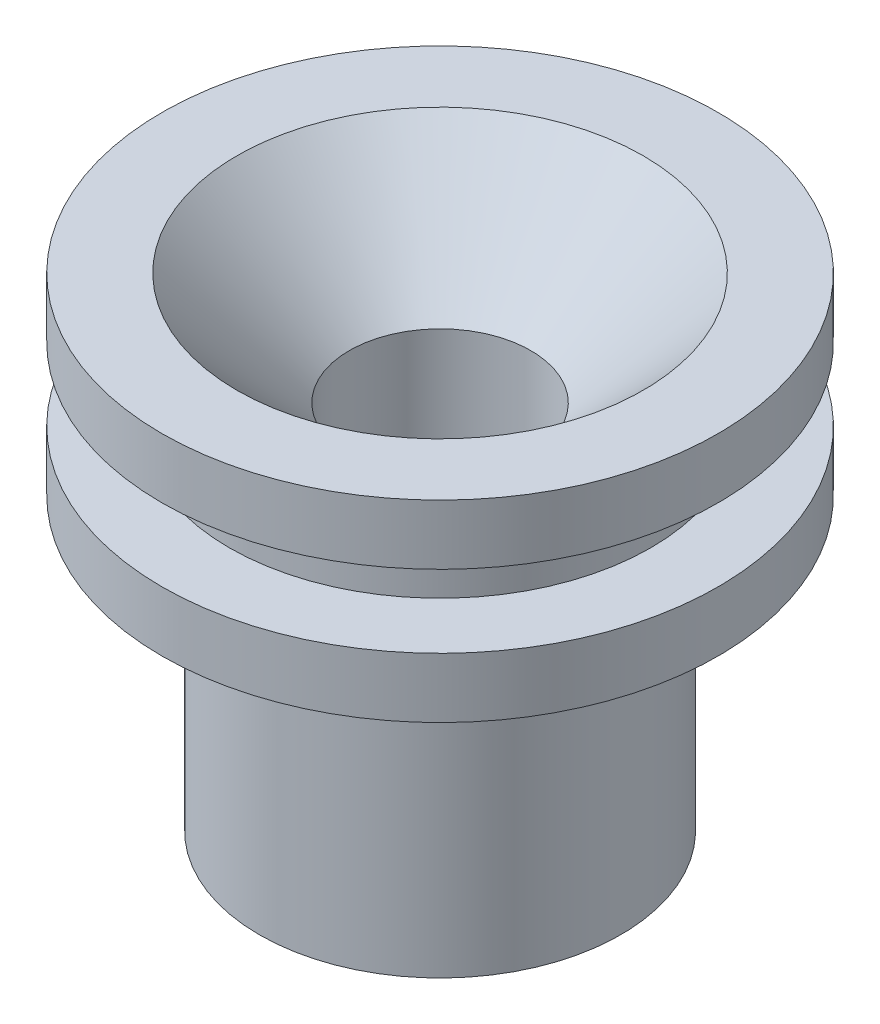
ISO-10303-21;
HEADER;
FILE_DESCRIPTION(('STEP AP214'),'2;1');
FILE_NAME('part.step','',(''),(''),'','','');
FILE_SCHEMA(('AUTOMOTIVE_DESIGN { 1 0 10303 214 1 1 1 1 }'));
ENDSEC;
DATA;
#1=APPLICATION_CONTEXT('core data for automotive mechanical design processes');
#2=APPLICATION_PROTOCOL_DEFINITION('international standard','automotive_design',2000,#1);
#3=PRODUCT_CONTEXT('',#1,'mechanical');
#4=PRODUCT('Part','Part','',(#3));
#5=PRODUCT_RELATED_PRODUCT_CATEGORY('part','',(#4));
#6=PRODUCT_DEFINITION_FORMATION('','',#4);
#7=PRODUCT_DEFINITION_CONTEXT('part definition',#1,'design');
#8=PRODUCT_DEFINITION('design','',#6,#7);
#9=PRODUCT_DEFINITION_SHAPE('','',#8);
#10=(LENGTH_UNIT() NAMED_UNIT(*) SI_UNIT(.MILLI.,.METRE.));
#11=(NAMED_UNIT(*) PLANE_ANGLE_UNIT() SI_UNIT($,.RADIAN.));
#12=(NAMED_UNIT(*) SI_UNIT($,.STERADIAN.) SOLID_ANGLE_UNIT());
#13=UNCERTAINTY_MEASURE_WITH_UNIT(LENGTH_MEASURE(1.E-05),#10,'distance_accuracy_value','');
#14=(GEOMETRIC_REPRESENTATION_CONTEXT(3) GLOBAL_UNCERTAINTY_ASSIGNED_CONTEXT((#13)) GLOBAL_UNIT_ASSIGNED_CONTEXT((#10,
#11,#12)) REPRESENTATION_CONTEXT('',''));
#15=CARTESIAN_POINT('',(0.,0.,0.));
#16=DIRECTION('',(0.,0.,1.));
#17=DIRECTION('',(1.,0.,0.));
#18=AXIS2_PLACEMENT_3D('',#15,#16,#17);
#19=CARTESIAN_POINT('',(0.,0.,0.));
#20=DIRECTION('',(0.,1.,0.));
#21=DIRECTION('',(0.,0.,1.));
#22=AXIS2_PLACEMENT_3D('',#19,#20,#21);
#23=PLANE('',#22);
#24=CARTESIAN_POINT('',(0.,0.,0.));
#25=DIRECTION('',(0.,-1.,0.));
#26=DIRECTION('',(0.,0.,-1.));
#27=AXIS2_PLACEMENT_3D('',#24,#25,#26);
#28=CIRCLE('',#27,1.5494);
#29=CARTESIAN_POINT('',(0.,0.,-1.5494));
#30=VERTEX_POINT('',#29);
#31=EDGE_CURVE('E58',#30,#30,#28,.T.);
#32=ORIENTED_EDGE('',*,*,#31,.F.);
#33=EDGE_LOOP('',(#32));
#34=FACE_BOUND('',#33,.T.);
#35=CARTESIAN_POINT('',(0.,0.,0.));
#36=DIRECTION('',(0.,1.,0.));
#37=DIRECTION('',(0.,0.,1.));
#38=AXIS2_PLACEMENT_3D('',#35,#36,#37);
#39=CIRCLE('',#38,6.1214);
#40=CARTESIAN_POINT('',(0.,0.,6.1214));
#41=VERTEX_POINT('',#40);
#42=EDGE_CURVE('E48',#41,#41,#39,.T.);
#43=ORIENTED_EDGE('',*,*,#42,.F.);
#44=EDGE_LOOP('',(#43));
#45=FACE_BOUND('',#44,.T.);
#46=ADVANCED_FACE('F36',(#34,#45),#23,.F.);
#47=CARTESIAN_POINT('',(0.,16.3576,0.));
#48=DIRECTION('',(0.,1.,0.));
#49=DIRECTION('',(0.,0.,1.));
#50=AXIS2_PLACEMENT_3D('',#47,#48,#49);
#51=CYLINDRICAL_SURFACE('',#50,6.1214);
#52=CARTESIAN_POINT('',(0.,9.8298,0.));
#53=DIRECTION('',(0.,1.,0.));
#54=DIRECTION('',(0.,0.,1.));
#55=AXIS2_PLACEMENT_3D('',#52,#53,#54);
#56=CIRCLE('',#55,6.1214);
#57=CARTESIAN_POINT('',(0.,9.8298,6.1214));
#58=VERTEX_POINT('',#57);
#59=EDGE_CURVE('E52',#58,#58,#56,.T.);
#60=ORIENTED_EDGE('',*,*,#59,.F.);
#61=EDGE_LOOP('',(#60));
#62=FACE_BOUND('',#61,.T.);
#63=ORIENTED_EDGE('',*,*,#42,.T.);
#64=EDGE_LOOP('',(#63));
#65=FACE_BOUND('',#64,.T.);
#66=ADVANCED_FACE('F89',(#62,#65),#51,.T.);
#67=CARTESIAN_POINT('',(9.4234,9.8298,0.));
#68=DIRECTION('',(0.,1.,0.));
#69=DIRECTION('',(0.,0.,1.));
#70=AXIS2_PLACEMENT_3D('',#67,#68,#69);
#71=PLANE('',#70);
#72=CARTESIAN_POINT('',(0.,9.8298,0.));
#73=DIRECTION('',(0.,1.,0.));
#74=DIRECTION('',(0.,0.,1.));
#75=AXIS2_PLACEMENT_3D('',#72,#73,#74);
#76=CIRCLE('',#75,9.4234);
#77=CARTESIAN_POINT('',(0.,9.8298,9.4234));
#78=VERTEX_POINT('',#77);
#79=EDGE_CURVE('E62',#78,#78,#76,.T.);
#80=ORIENTED_EDGE('',*,*,#79,.F.);
#81=EDGE_LOOP('',(#80));
#82=FACE_BOUND('',#81,.T.);
#83=ORIENTED_EDGE('',*,*,#59,.T.);
#84=EDGE_LOOP('',(#83));
#85=FACE_BOUND('',#84,.T.);
#86=ADVANCED_FACE('F93',(#82,#85),#71,.F.);
#87=CARTESIAN_POINT('',(0.,16.3576,0.));
#88=DIRECTION('',(0.,1.,0.));
#89=DIRECTION('',(0.,0.,1.));
#90=AXIS2_PLACEMENT_3D('',#87,#88,#89);
#91=CYLINDRICAL_SURFACE('',#90,9.4234);
#92=CARTESIAN_POINT('',(0.,11.8618,0.));
#93=DIRECTION('',(0.,1.,0.));
#94=DIRECTION('',(0.,0.,1.));
#95=AXIS2_PLACEMENT_3D('',#92,#93,#94);
#96=CIRCLE('',#95,9.4234);
#97=CARTESIAN_POINT('',(0.,11.8618,9.4234));
#98=VERTEX_POINT('',#97);
#99=EDGE_CURVE('E65',#98,#98,#96,.T.);
#100=ORIENTED_EDGE('',*,*,#99,.F.);
#101=EDGE_LOOP('',(#100));
#102=FACE_BOUND('',#101,.T.);
#103=ORIENTED_EDGE('',*,*,#79,.T.);
#104=EDGE_LOOP('',(#103));
#105=FACE_BOUND('',#104,.T.);
#106=ADVANCED_FACE('F99',(#102,#105),#91,.T.);
#107=CARTESIAN_POINT('',(9.4234,11.8618,0.));
#108=DIRECTION('',(0.,-1.,0.));
#109=DIRECTION('',(0.,0.,-1.));
#110=AXIS2_PLACEMENT_3D('',#107,#108,#109);
#111=PLANE('',#110);
#112=CARTESIAN_POINT('',(0.,11.8618,0.));
#113=DIRECTION('',(0.,1.,0.));
#114=DIRECTION('',(0.,0.,1.));
#115=AXIS2_PLACEMENT_3D('',#112,#113,#114);
#116=CIRCLE('',#115,7.1374);
#117=CARTESIAN_POINT('',(0.,11.8618,7.1374));
#118=VERTEX_POINT('',#117);
#119=EDGE_CURVE('E68',#118,#118,#116,.T.);
#120=ORIENTED_EDGE('',*,*,#119,.F.);
#121=EDGE_LOOP('',(#120));
#122=FACE_BOUND('',#121,.T.);
#123=ORIENTED_EDGE('',*,*,#99,.T.);
#124=EDGE_LOOP('',(#123));
#125=FACE_BOUND('',#124,.T.);
#126=ADVANCED_FACE('F106',(#122,#125),#111,.F.);
#127=CARTESIAN_POINT('',(0.,16.3576,0.));
#128=DIRECTION('',(0.,1.,0.));
#129=DIRECTION('',(0.,0.,1.));
#130=AXIS2_PLACEMENT_3D('',#127,#128,#129);
#131=CYLINDRICAL_SURFACE('',#130,7.1374);
#132=CARTESIAN_POINT('',(0.,14.3256,0.));
#133=DIRECTION('',(0.,1.,0.));
#134=DIRECTION('',(0.,0.,1.));
#135=AXIS2_PLACEMENT_3D('',#132,#133,#134);
#136=CIRCLE('',#135,7.1374);
#137=CARTESIAN_POINT('',(0.,14.3256,7.1374));
#138=VERTEX_POINT('',#137);
#139=EDGE_CURVE('E71',#138,#138,#136,.T.);
#140=ORIENTED_EDGE('',*,*,#139,.F.);
#141=EDGE_LOOP('',(#140));
#142=FACE_BOUND('',#141,.T.);
#143=ORIENTED_EDGE('',*,*,#119,.T.);
#144=EDGE_LOOP('',(#143));
#145=FACE_BOUND('',#144,.T.);
#146=ADVANCED_FACE('F110',(#142,#145),#131,.T.);
#147=CARTESIAN_POINT('',(7.1374,14.3256,0.));
#148=DIRECTION('',(0.,1.,0.));
#149=DIRECTION('',(0.,0.,1.));
#150=AXIS2_PLACEMENT_3D('',#147,#148,#149);
#151=PLANE('',#150);
#152=CARTESIAN_POINT('',(0.,14.3256,0.));
#153=DIRECTION('',(0.,1.,0.));
#154=DIRECTION('',(0.,0.,1.));
#155=AXIS2_PLACEMENT_3D('',#152,#153,#154);
#156=CIRCLE('',#155,9.4234);
#157=CARTESIAN_POINT('',(0.,14.3256,9.4234));
#158=VERTEX_POINT('',#157);
#159=EDGE_CURVE('E74',#158,#158,#156,.T.);
#160=ORIENTED_EDGE('',*,*,#159,.F.);
#161=EDGE_LOOP('',(#160));
#162=FACE_BOUND('',#161,.T.);
#163=ORIENTED_EDGE('',*,*,#139,.T.);
#164=EDGE_LOOP('',(#163));
#165=FACE_BOUND('',#164,.T.);
#166=ADVANCED_FACE('F114',(#162,#165),#151,.F.);
#167=CARTESIAN_POINT('',(0.,16.3576,0.));
#168=DIRECTION('',(0.,1.,0.));
#169=DIRECTION('',(0.,0.,1.));
#170=AXIS2_PLACEMENT_3D('',#167,#168,#169);
#171=CYLINDRICAL_SURFACE('',#170,9.4234);
#172=CARTESIAN_POINT('',(0.,16.3576,0.));
#173=DIRECTION('',(0.,1.,0.));
#174=DIRECTION('',(0.,0.,1.));
#175=AXIS2_PLACEMENT_3D('',#172,#173,#174);
#176=CIRCLE('',#175,9.4234);
#177=CARTESIAN_POINT('',(0.,16.3576,9.4234));
#178=VERTEX_POINT('',#177);
#179=EDGE_CURVE('E77',#178,#178,#176,.T.);
#180=ORIENTED_EDGE('',*,*,#179,.F.);
#181=EDGE_LOOP('',(#180));
#182=FACE_BOUND('',#181,.T.);
#183=ORIENTED_EDGE('',*,*,#159,.T.);
#184=EDGE_LOOP('',(#183));
#185=FACE_BOUND('',#184,.T.);
#186=ADVANCED_FACE('F118',(#182,#185),#171,.T.);
#187=CARTESIAN_POINT('',(9.4234,16.3576,0.));
#188=DIRECTION('',(0.,-1.,0.));
#189=DIRECTION('',(0.,0.,-1.));
#190=AXIS2_PLACEMENT_3D('',#187,#188,#189);
#191=PLANE('',#190);
#192=CARTESIAN_POINT('',(0.,16.3576,0.));
#193=DIRECTION('',(0.,-1.,0.));
#194=DIRECTION('',(0.,0.,-1.));
#195=AXIS2_PLACEMENT_3D('',#192,#193,#194);
#196=CIRCLE('',#195,6.88340000000004);
#197=CARTESIAN_POINT('',(0.,16.3576,6.88340000000004));
#198=VERTEX_POINT('',#197);
#199=EDGE_CURVE('E10',#198,#198,#196,.T.);
#200=ORIENTED_EDGE('',*,*,#199,.T.);
#201=EDGE_LOOP('',(#200));
#202=FACE_BOUND('',#201,.T.);
#203=ORIENTED_EDGE('',*,*,#179,.T.);
#204=EDGE_LOOP('',(#203));
#205=FACE_BOUND('',#204,.T.);
#206=ADVANCED_FACE('F122',(#202,#205),#191,.F.);
#207=CARTESIAN_POINT('',(0.,0.863599999999999,0.));
#208=DIRECTION('',(0.,1.,0.));
#209=DIRECTION('',(0.,0.,1.));
#210=AXIS2_PLACEMENT_3D('',#207,#208,#209);
#211=CYLINDRICAL_SURFACE('',#210,3.0734);
#212=CARTESIAN_POINT('',(0.,12.5476,0.));
#213=DIRECTION('',(0.,-1.,0.));
#214=DIRECTION('',(0.,0.,-1.));
#215=AXIS2_PLACEMENT_3D('',#212,#213,#214);
#216=CIRCLE('',#215,3.0734);
#217=CARTESIAN_POINT('',(0.,12.5476,3.0734));
#218=VERTEX_POINT('',#217);
#219=EDGE_CURVE('E44',#218,#218,#216,.F.);
#220=CARTESIAN_POINT('',(0.,0.863599999999999,0.));
#221=DIRECTION('',(0.,1.,0.));
#222=DIRECTION('',(0.,0.,1.));
#223=AXIS2_PLACEMENT_3D('',#220,#221,#222);
#224=CIRCLE('',#223,3.0734);
#225=CARTESIAN_POINT('',(0.,0.863599999999999,3.0734));
#226=VERTEX_POINT('',#225);
#227=EDGE_CURVE('E57',#226,#226,#224,.T.);
#228=CARTESIAN_POINT('',(0.,12.5476,3.0734));
#229=CARTESIAN_POINT('',(0.,12.4258916666666,3.0734));
#230=CARTESIAN_POINT('',(0.,12.3041833333333,3.0734));
#231=CARTESIAN_POINT('',(0.,12.0607666666666,3.0734));
#232=CARTESIAN_POINT('',(0.,11.9390583333333,3.0734));
#233=CARTESIAN_POINT('',(0.,11.6956416666666,3.0734));
#234=CARTESIAN_POINT('',(0.,11.5739333333333,3.0734));
#235=CARTESIAN_POINT('',(0.,11.3305166666666,3.0734));
#236=CARTESIAN_POINT('',(0.,11.2088083333333,3.0734));
#237=CARTESIAN_POINT('',(0.,10.9653916666666,3.0734));
#238=CARTESIAN_POINT('',(0.,10.8436833333333,3.0734));
#239=CARTESIAN_POINT('',(0.,10.6002666666666,3.0734));
#240=CARTESIAN_POINT('',(0.,10.4785583333333,3.0734));
#241=CARTESIAN_POINT('',(0.,10.2351416666666,3.0734));
#242=CARTESIAN_POINT('',(0.,10.1134333333333,3.0734));
#243=CARTESIAN_POINT('',(0.,9.87001666666665,3.0734));
#244=CARTESIAN_POINT('',(0.,9.74830833333331,3.0734));
#245=CARTESIAN_POINT('',(0.,9.50489166666665,3.0734));
#246=CARTESIAN_POINT('',(0.,9.38318333333331,3.0734));
#247=CARTESIAN_POINT('',(0.,9.13976666666665,3.0734));
#248=CARTESIAN_POINT('',(0.,9.01805833333331,3.0734));
#249=CARTESIAN_POINT('',(0.,8.77464166666665,3.0734));
#250=CARTESIAN_POINT('',(0.,8.65293333333332,3.0734));
#251=CARTESIAN_POINT('',(0.,8.40951666666665,3.0734));
#252=CARTESIAN_POINT('',(0.,8.28780833333331,3.0734));
#253=CARTESIAN_POINT('',(0.,8.04439166666665,3.0734));
#254=CARTESIAN_POINT('',(0.,7.92268333333332,3.0734));
#255=CARTESIAN_POINT('',(0.,7.67926666666665,3.0734));
#256=CARTESIAN_POINT('',(0.,7.55755833333332,3.0734));
#257=CARTESIAN_POINT('',(0.,7.31414166666665,3.0734));
#258=CARTESIAN_POINT('',(0.,7.19243333333332,3.0734));
#259=CARTESIAN_POINT('',(0.,6.94901666666665,3.0734));
#260=CARTESIAN_POINT('',(0.,6.82730833333332,3.0734));
#261=CARTESIAN_POINT('',(0.,6.58389166666665,3.0734));
#262=CARTESIAN_POINT('',(0.,6.46218333333332,3.0734));
#263=CARTESIAN_POINT('',(0.,6.21876666666665,3.0734));
#264=CARTESIAN_POINT('',(0.,6.09705833333332,3.0734));
#265=CARTESIAN_POINT('',(0.,5.85364166666665,3.0734));
#266=CARTESIAN_POINT('',(0.,5.73193333333332,3.0734));
#267=CARTESIAN_POINT('',(0.,5.48851666666666,3.0734));
#268=CARTESIAN_POINT('',(0.,5.36680833333332,3.0734));
#269=CARTESIAN_POINT('',(0.,5.12339166666666,3.0734));
#270=CARTESIAN_POINT('',(0.,5.00168333333332,3.0734));
#271=CARTESIAN_POINT('',(0.,4.75826666666666,3.0734));
#272=CARTESIAN_POINT('',(0.,4.63655833333332,3.0734));
#273=CARTESIAN_POINT('',(0.,4.39314166666666,3.0734));
#274=CARTESIAN_POINT('',(0.,4.27143333333333,3.0734));
#275=CARTESIAN_POINT('',(0.,4.02801666666666,3.0734));
#276=CARTESIAN_POINT('',(0.,3.90630833333333,3.0734));
#277=CARTESIAN_POINT('',(0.,3.66289166666666,3.0734));
#278=CARTESIAN_POINT('',(0.,3.54118333333333,3.0734));
#279=CARTESIAN_POINT('',(0.,3.29776666666666,3.0734));
#280=CARTESIAN_POINT('',(0.,3.17605833333333,3.0734));
#281=CARTESIAN_POINT('',(0.,2.93264166666666,3.0734));
#282=CARTESIAN_POINT('',(0.,2.81093333333333,3.0734));
#283=CARTESIAN_POINT('',(0.,2.56751666666666,3.0734));
#284=CARTESIAN_POINT('',(0.,2.44580833333333,3.0734));
#285=CARTESIAN_POINT('',(0.,2.20239166666666,3.0734));
#286=CARTESIAN_POINT('',(0.,2.08068333333333,3.0734));
#287=CARTESIAN_POINT('',(0.,1.83726666666666,3.0734));
#288=CARTESIAN_POINT('',(0.,1.71555833333333,3.0734));
#289=CARTESIAN_POINT('',(0.,1.47214166666666,3.0734));
#290=CARTESIAN_POINT('',(0.,1.35043333333333,3.0734));
#291=CARTESIAN_POINT('',(0.,1.10701666666667,3.0734));
#292=CARTESIAN_POINT('',(0.,0.985308333333332,3.0734));
#293=CARTESIAN_POINT('',(0.,0.863599999999999,3.0734));
#294=B_SPLINE_CURVE_WITH_KNOTS('',3,(#228,#229,#230,#231,#232,#233,#234,#235,#236,#237,#238,
#239,#240,#241,#242,#243,#244,#245,#246,#247,#248,#249,#250,#251,#252,#253,#254,#255,#256,#257,
#258,#259,#260,#261,#262,#263,#264,#265,#266,#267,#268,#269,#270,#271,#272,#273,#274,#275,#276,
#277,#278,#279,#280,#281,#282,#283,#284,#285,#286,#287,#288,#289,#290,#291,#292,#293),
.UNSPECIFIED.,.F.,.F.,(4,2,2,2,2,2,2,2,2,2,2,2,2,2,2,2,2,2,2,2,2,2,2,2,2,2,2,2,2,2,2,2,4),(0.,
0.365124999999999,0.730249999999998,1.095375,1.4605,1.825625,2.19074999999999,2.555875,
2.92099999999999,3.28612499999999,3.65124999999999,4.01637499999999,4.38149999999999,
4.74662499999999,5.11174999999999,5.47687499999999,5.84199999999999,6.20712499999999,
6.57224999999999,6.93737499999998,7.30249999999998,7.66762499999998,8.03274999999998,
8.39787499999998,8.76299999999998,9.12812499999998,9.49324999999998,9.85837499999998,10.2235,
10.588625,10.95375,11.318875,11.684),.UNSPECIFIED.);
#295=EDGE_CURVE('BSEAM126',#218,#226,#294,.T.);
#296=ORIENTED_EDGE('',*,*,#219,.T.);
#297=ORIENTED_EDGE('',*,*,#227,.F.);
#298=ORIENTED_EDGE('',*,*,#295,.T.);
#299=ORIENTED_EDGE('',*,*,#295,.F.);
#300=EDGE_LOOP('',(#296,#298,#297,#299));
#301=FACE_BOUND('',#300,.T.);
#302=ADVANCED_FACE('F126',(#301),#211,.F.);
#303=CARTESIAN_POINT('',(0.,0.863599999999999,0.));
#304=DIRECTION('',(0.,1.,0.));
#305=DIRECTION('',(0.,0.,1.));
#306=AXIS2_PLACEMENT_3D('',#303,#304,#305);
#307=PLANE('',#306);
#308=CARTESIAN_POINT('',(0.,0.863599999999999,0.));
#309=DIRECTION('',(0.,1.,0.));
#310=DIRECTION('',(0.,0.,1.));
#311=AXIS2_PLACEMENT_3D('',#308,#309,#310);
#312=CIRCLE('',#311,1.5494);
#313=CARTESIAN_POINT('',(0.,0.863599999999999,1.5494));
#314=VERTEX_POINT('',#313);
#315=EDGE_CURVE('E55',#314,#314,#312,.T.);
#316=ORIENTED_EDGE('',*,*,#315,.F.);
#317=EDGE_LOOP('',(#316));
#318=FACE_BOUND('',#317,.T.);
#319=ORIENTED_EDGE('',*,*,#227,.T.);
#320=EDGE_LOOP('',(#319));
#321=FACE_BOUND('',#320,.T.);
#322=ADVANCED_FACE('F129',(#318,#321),#307,.T.);
#323=CARTESIAN_POINT('',(0.,16.3576,0.));
#324=DIRECTION('',(0.,-1.,0.));
#325=DIRECTION('',(0.,0.,-1.));
#326=AXIS2_PLACEMENT_3D('',#323,#324,#325);
#327=CYLINDRICAL_SURFACE('',#326,1.5494);
#328=ORIENTED_EDGE('',*,*,#315,.T.);
#329=EDGE_LOOP('',(#328));
#330=FACE_BOUND('',#329,.T.);
#331=ORIENTED_EDGE('',*,*,#31,.T.);
#332=EDGE_LOOP('',(#331));
#333=FACE_BOUND('',#332,.T.);
#334=ADVANCED_FACE('F85',(#330,#333),#327,.F.);
#335=CARTESIAN_POINT('',(0.,12.5476,0.));
#336=DIRECTION('',(0.,1.,0.));
#337=DIRECTION('',(0.,0.,1.));
#338=AXIS2_PLACEMENT_3D('',#335,#336,#337);
#339=CONICAL_SURFACE('',#338,3.0734,0.78539816339745);
#340=CARTESIAN_POINT('',(0.,16.3576,6.88340000000004));
#341=CARTESIAN_POINT('',(0.,16.3179125,6.84371250000004));
#342=CARTESIAN_POINT('',(0.,16.278225,6.80402500000004));
#343=CARTESIAN_POINT('',(0.,16.19885,6.72465000000004));
#344=CARTESIAN_POINT('',(0.,16.1591625,6.68496250000004));
#345=CARTESIAN_POINT('',(0.,16.0797875,6.60558750000004));
#346=CARTESIAN_POINT('',(0.,16.0401,6.56590000000004));
#347=CARTESIAN_POINT('',(0.,15.960725,6.48652500000004));
#348=CARTESIAN_POINT('',(0.,15.9210375,6.44683750000004));
#349=CARTESIAN_POINT('',(0.,15.8416625,6.36746250000004));
#350=CARTESIAN_POINT('',(0.,15.801975,6.32777500000004));
#351=CARTESIAN_POINT('',(0.,15.7226,6.24840000000004));
#352=CARTESIAN_POINT('',(0.,15.6829125,6.20871250000004));
#353=CARTESIAN_POINT('',(0.,15.6035375,6.12933750000004));
#354=CARTESIAN_POINT('',(0.,15.56385,6.08965000000004));
#355=CARTESIAN_POINT('',(0.,15.484475,6.01027500000003));
#356=CARTESIAN_POINT('',(0.,15.4447875,5.97058750000003));
#357=CARTESIAN_POINT('',(0.,15.3654125,5.89121250000003));
#358=CARTESIAN_POINT('',(0.,15.325725,5.85152500000003));
#359=CARTESIAN_POINT('',(0.,15.24635,5.77215000000003));
#360=CARTESIAN_POINT('',(0.,15.2066625,5.73246250000003));
#361=CARTESIAN_POINT('',(0.,15.1272875,5.65308750000003));
#362=CARTESIAN_POINT('',(0.,15.0876,5.61340000000003));
#363=CARTESIAN_POINT('',(0.,15.008225,5.53402500000003));
#364=CARTESIAN_POINT('',(0.,14.9685375,5.49433750000003));
#365=CARTESIAN_POINT('',(0.,14.8891625,5.41496250000003));
#366=CARTESIAN_POINT('',(0.,14.849475,5.37527500000003));
#367=CARTESIAN_POINT('',(0.,14.7701,5.29590000000003));
#368=CARTESIAN_POINT('',(0.,14.7304125,5.25621250000003));
#369=CARTESIAN_POINT('',(0.,14.6510375,5.17683750000003));
#370=CARTESIAN_POINT('',(0.,14.61135,5.13715000000002));
#371=CARTESIAN_POINT('',(0.,14.531975,5.05777500000002));
#372=CARTESIAN_POINT('',(0.,14.4922875,5.01808750000002));
#373=CARTESIAN_POINT('',(0.,14.4129125,4.93871250000002));
#374=CARTESIAN_POINT('',(0.,14.373225,4.89902500000002));
#375=CARTESIAN_POINT('',(0.,14.29385,4.81965000000002));
#376=CARTESIAN_POINT('',(0.,14.2541625,4.77996250000002));
#377=CARTESIAN_POINT('',(0.,14.1747875,4.70058750000002));
#378=CARTESIAN_POINT('',(0.,14.1351,4.66090000000002));
#379=CARTESIAN_POINT('',(0.,14.055725,4.58152500000002));
#380=CARTESIAN_POINT('',(0.,14.0160375,4.54183750000002));
#381=CARTESIAN_POINT('',(0.,13.9366625,4.46246250000002));
#382=CARTESIAN_POINT('',(0.,13.896975,4.42277500000001));
#383=CARTESIAN_POINT('',(0.,13.8176,4.34340000000001));
#384=CARTESIAN_POINT('',(0.,13.7779125,4.30371250000001));
#385=CARTESIAN_POINT('',(0.,13.6985375,4.22433750000001));
#386=CARTESIAN_POINT('',(0.,13.65885,4.18465000000001));
#387=CARTESIAN_POINT('',(0.,13.579475,4.10527500000001));
#388=CARTESIAN_POINT('',(0.,13.5397875,4.06558750000001));
#389=CARTESIAN_POINT('',(0.,13.4604125,3.98621250000001));
#390=CARTESIAN_POINT('',(0.,13.420725,3.94652500000001));
#391=CARTESIAN_POINT('',(0.,13.34135,3.86715000000001));
#392=CARTESIAN_POINT('',(0.,13.3016625,3.82746250000001));
#393=CARTESIAN_POINT('',(0.,13.2222875,3.74808750000001));
#394=CARTESIAN_POINT('',(0.,13.1826,3.70840000000001));
#395=CARTESIAN_POINT('',(0.,13.103225,3.62902500000001));
#396=CARTESIAN_POINT('',(0.,13.0635375,3.5893375));
#397=CARTESIAN_POINT('',(0.,12.9841625,3.5099625));
#398=CARTESIAN_POINT('',(0.,12.944475,3.470275));
#399=CARTESIAN_POINT('',(0.,12.8651,3.3909));
#400=CARTESIAN_POINT('',(0.,12.8254125,3.3512125));
#401=CARTESIAN_POINT('',(0.,12.7460375,3.2718375));
#402=CARTESIAN_POINT('',(0.,12.70635,3.23215));
#403=CARTESIAN_POINT('',(0.,12.626975,3.152775));
#404=CARTESIAN_POINT('',(0.,12.5872875,3.1130875));
#405=CARTESIAN_POINT('',(0.,12.5476,3.0734));
#406=B_SPLINE_CURVE_WITH_KNOTS('',3,(#340,#341,#342,#343,#344,#345,#346,#347,#348,#349,#350,
#351,#352,#353,#354,#355,#356,#357,#358,#359,#360,#361,#362,#363,#364,#365,#366,#367,#368,#369,
#370,#371,#372,#373,#374,#375,#376,#377,#378,#379,#380,#381,#382,#383,#384,#385,#386,#387,#388,
#389,#390,#391,#392,#393,#394,#395,#396,#397,#398,#399,#400,#401,#402,#403,#404,#405),
.UNSPECIFIED.,.F.,.F.,(4,2,2,2,2,2,2,2,2,2,2,2,2,2,2,2,2,2,2,2,2,2,2,2,2,2,2,2,2,2,2,2,4),(0.,
0.168379802270049,0.336759604540096,0.505139406810146,0.673519209080193,0.841899011350243,
1.01027881362029,1.17865861589034,1.34703841816039,1.51541822043043,1.68379802270048,
1.85217782497053,2.02055762724058,2.18893742951063,2.35731723178068,2.52569703405072,
2.69407683632077,2.86245663859082,3.03083644086087,3.19921624313092,3.36759604540097,
3.53597584767102,3.70435564994106,3.87273545221111,4.04111525448116,4.20949505675121,
4.37787485902126,4.54625466129131,4.71463446356135,4.8830142658314,5.05139406810145,
5.2197738703715,5.38815367264155),.UNSPECIFIED.);
#407=EDGE_CURVE('BSEAM39',#198,#218,#406,.T.);
#408=ORIENTED_EDGE('',*,*,#199,.F.);
#409=ORIENTED_EDGE('',*,*,#219,.F.);
#410=ORIENTED_EDGE('',*,*,#407,.T.);
#411=ORIENTED_EDGE('',*,*,#407,.F.);
#412=EDGE_LOOP('',(#408,#410,#409,#411));
#413=FACE_BOUND('',#412,.T.);
#414=ADVANCED_FACE('F39',(#413),#339,.F.);
#415=CLOSED_SHELL('',(#46,#66,#86,#106,#126,#146,#166,#186,#206,#302,#322,#334,#414));
#416=MANIFOLD_SOLID_BREP('B2',#415);
#417=ADVANCED_BREP_SHAPE_REPRESENTATION('',(#18,#416),#14);
#418=SHAPE_DEFINITION_REPRESENTATION(#9,#417);
ENDSEC;
END-ISO-10303-21;
